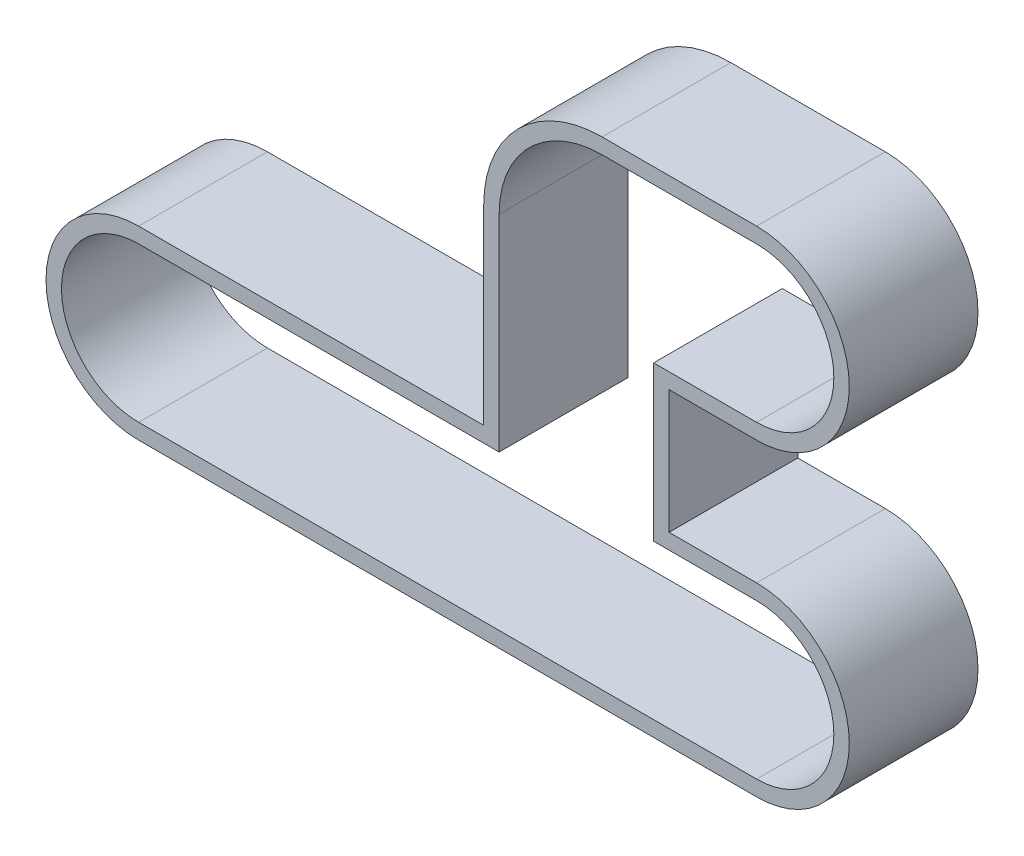
ISO-10303-21;
HEADER;
FILE_DESCRIPTION(('STEP AP214'),'2;1');
FILE_NAME('part.step','',(''),(''),'','','');
FILE_SCHEMA(('AUTOMOTIVE_DESIGN { 1 0 10303 214 1 1 1 1 }'));
ENDSEC;
DATA;
#1=APPLICATION_CONTEXT('core data for automotive mechanical design processes');
#2=APPLICATION_PROTOCOL_DEFINITION('international standard','automotive_design',2000,#1);
#3=PRODUCT_CONTEXT('',#1,'mechanical');
#4=PRODUCT('Part','Part','',(#3));
#5=PRODUCT_RELATED_PRODUCT_CATEGORY('part','',(#4));
#6=PRODUCT_DEFINITION_FORMATION('','',#4);
#7=PRODUCT_DEFINITION_CONTEXT('part definition',#1,'design');
#8=PRODUCT_DEFINITION('design','',#6,#7);
#9=PRODUCT_DEFINITION_SHAPE('','',#8);
#10=(LENGTH_UNIT() NAMED_UNIT(*) SI_UNIT(.MILLI.,.METRE.));
#11=(NAMED_UNIT(*) PLANE_ANGLE_UNIT() SI_UNIT($,.RADIAN.));
#12=(NAMED_UNIT(*) SI_UNIT($,.STERADIAN.) SOLID_ANGLE_UNIT());
#13=UNCERTAINTY_MEASURE_WITH_UNIT(LENGTH_MEASURE(1.E-05),#10,'distance_accuracy_value','');
#14=(GEOMETRIC_REPRESENTATION_CONTEXT(3) GLOBAL_UNCERTAINTY_ASSIGNED_CONTEXT((#13)) GLOBAL_UNIT_ASSIGNED_CONTEXT((#10,
#11,#12)) REPRESENTATION_CONTEXT('',''));
#15=CARTESIAN_POINT('',(0.,0.,0.));
#16=DIRECTION('',(0.,0.,1.));
#17=DIRECTION('',(1.,0.,0.));
#18=AXIS2_PLACEMENT_3D('',#15,#16,#17);
#19=CARTESIAN_POINT('',(0.,15.,25.));
#20=DIRECTION('',(0.,0.,1.));
#21=DIRECTION('',(1.,0.,0.));
#22=AXIS2_PLACEMENT_3D('',#19,#20,#21);
#23=PLANE('',#22);
#24=CARTESIAN_POINT('',(0.,15.,25.));
#25=DIRECTION('',(0.,0.,1.));
#26=DIRECTION('',(1.,0.,0.));
#27=AXIS2_PLACEMENT_3D('',#24,#25,#26);
#28=CIRCLE('',#27,18.);
#29=CARTESIAN_POINT('',(0.,33.,25.));
#30=VERTEX_POINT('',#29);
#31=CARTESIAN_POINT('',(0.,-3.,25.));
#32=VERTEX_POINT('',#31);
#33=EDGE_CURVE('E374',#30,#32,#28,.T.);
#34=ORIENTED_EDGE('',*,*,#33,.T.);
#35=DIRECTION('',(1.,0.,0.));
#36=VECTOR('',#35,1.);
#37=CARTESIAN_POINT('',(0.,-3.,25.));
#38=LINE('',#37,#36);
#39=CARTESIAN_POINT('',(120.,-3.,25.));
#40=VERTEX_POINT('',#39);
#41=EDGE_CURVE('E378',#32,#40,#38,.T.);
#42=ORIENTED_EDGE('',*,*,#41,.T.);
#43=CARTESIAN_POINT('',(120.,15.,25.));
#44=DIRECTION('',(0.,0.,1.));
#45=DIRECTION('',(1.,0.,0.));
#46=AXIS2_PLACEMENT_3D('',#43,#44,#45);
#47=CIRCLE('',#46,18.);
#48=CARTESIAN_POINT('',(120.,33.,25.));
#49=VERTEX_POINT('',#48);
#50=EDGE_CURVE('E382',#40,#49,#47,.T.);
#51=ORIENTED_EDGE('',*,*,#50,.T.);
#52=DIRECTION('',(-1.,0.,0.));
#53=VECTOR('',#52,1.);
#54=CARTESIAN_POINT('',(120.,33.,25.));
#55=LINE('',#54,#53);
#56=CARTESIAN_POINT('',(103.,33.,25.));
#57=VERTEX_POINT('',#56);
#58=EDGE_CURVE('E385',#49,#57,#55,.T.);
#59=ORIENTED_EDGE('',*,*,#58,.T.);
#60=DIRECTION('',(0.,1.,0.));
#61=VECTOR('',#60,1.);
#62=CARTESIAN_POINT('',(103.,30.,25.));
#63=LINE('',#62,#61);
#64=CARTESIAN_POINT('',(103.,57.,25.));
#65=VERTEX_POINT('',#64);
#66=EDGE_CURVE('E388',#57,#65,#63,.T.);
#67=ORIENTED_EDGE('',*,*,#66,.T.);
#68=DIRECTION('',(1.,0.,0.));
#69=VECTOR('',#68,1.);
#70=CARTESIAN_POINT('',(100.,57.,25.));
#71=LINE('',#70,#69);
#72=CARTESIAN_POINT('',(120.,57.,25.));
#73=VERTEX_POINT('',#72);
#74=EDGE_CURVE('E391',#65,#73,#71,.T.);
#75=ORIENTED_EDGE('',*,*,#74,.T.);
#76=CARTESIAN_POINT('',(120.,75.,25.));
#77=DIRECTION('',(0.,0.,1.));
#78=DIRECTION('',(1.,0.,0.));
#79=AXIS2_PLACEMENT_3D('',#76,#77,#78);
#80=CIRCLE('',#79,18.);
#81=CARTESIAN_POINT('',(120.,93.,25.));
#82=VERTEX_POINT('',#81);
#83=EDGE_CURVE('E394',#73,#82,#80,.T.);
#84=ORIENTED_EDGE('',*,*,#83,.T.);
#85=DIRECTION('',(-1.,0.,0.));
#86=VECTOR('',#85,1.);
#87=CARTESIAN_POINT('',(120.,93.,25.));
#88=LINE('',#87,#86);
#89=CARTESIAN_POINT('',(90.,93.,25.));
#90=VERTEX_POINT('',#89);
#91=EDGE_CURVE('E397',#82,#90,#88,.T.);
#92=ORIENTED_EDGE('',*,*,#91,.T.);
#93=CARTESIAN_POINT('',(90.,70.,25.));
#94=DIRECTION('',(0.,0.,1.));
#95=DIRECTION('',(1.,0.,0.));
#96=AXIS2_PLACEMENT_3D('',#93,#94,#95);
#97=CIRCLE('',#96,23.);
#98=CARTESIAN_POINT('',(67.,70.,25.));
#99=VERTEX_POINT('',#98);
#100=EDGE_CURVE('E400',#90,#99,#97,.T.);
#101=ORIENTED_EDGE('',*,*,#100,.T.);
#102=DIRECTION('',(0.,-1.,0.));
#103=VECTOR('',#102,1.);
#104=CARTESIAN_POINT('',(67.,70.,25.));
#105=LINE('',#104,#103);
#106=CARTESIAN_POINT('',(67.,33.,25.));
#107=VERTEX_POINT('',#106);
#108=EDGE_CURVE('E403',#99,#107,#105,.T.);
#109=ORIENTED_EDGE('',*,*,#108,.T.);
#110=DIRECTION('',(-1.,0.,0.));
#111=VECTOR('',#110,1.);
#112=CARTESIAN_POINT('',(70.,33.,25.));
#113=LINE('',#112,#111);
#114=EDGE_CURVE('E406',#107,#30,#113,.T.);
#115=ORIENTED_EDGE('',*,*,#114,.T.);
#116=EDGE_LOOP('',(#34,#42,#51,#59,#67,#75,#84,#92,#101,#109,#115));
#117=FACE_BOUND('',#116,.T.);
#118=DIRECTION('',(1.,0.,0.));
#119=VECTOR('',#118,1.);
#120=CARTESIAN_POINT('',(0.,0.,25.));
#121=LINE('',#120,#119);
#122=CARTESIAN_POINT('',(0.,0.,25.));
#123=VERTEX_POINT('',#122);
#124=CARTESIAN_POINT('',(120.,0.,25.));
#125=VERTEX_POINT('',#124);
#126=EDGE_CURVE('E264',#123,#125,#121,.T.);
#127=ORIENTED_EDGE('',*,*,#126,.F.);
#128=CARTESIAN_POINT('',(0.,15.,25.));
#129=DIRECTION('',(0.,0.,1.));
#130=DIRECTION('',(1.,0.,0.));
#131=AXIS2_PLACEMENT_3D('',#128,#129,#130);
#132=CIRCLE('',#131,15.);
#133=CARTESIAN_POINT('',(0.,30.,25.));
#134=VERTEX_POINT('',#133);
#135=EDGE_CURVE('E255',#134,#123,#132,.T.);
#136=ORIENTED_EDGE('',*,*,#135,.F.);
#137=DIRECTION('',(-1.,0.,0.));
#138=VECTOR('',#137,1.);
#139=CARTESIAN_POINT('',(70.,30.,25.));
#140=LINE('',#139,#138);
#141=CARTESIAN_POINT('',(70.,30.,25.));
#142=VERTEX_POINT('',#141);
#143=EDGE_CURVE('E305',#142,#134,#140,.T.);
#144=ORIENTED_EDGE('',*,*,#143,.F.);
#145=DIRECTION('',(0.,-1.,0.));
#146=VECTOR('',#145,1.);
#147=CARTESIAN_POINT('',(70.,70.,25.));
#148=LINE('',#147,#146);
#149=CARTESIAN_POINT('',(70.,70.,25.));
#150=VERTEX_POINT('',#149);
#151=EDGE_CURVE('E302',#150,#142,#148,.T.);
#152=ORIENTED_EDGE('',*,*,#151,.F.);
#153=CARTESIAN_POINT('',(90.,70.,25.));
#154=DIRECTION('',(0.,0.,1.));
#155=DIRECTION('',(1.,0.,0.));
#156=AXIS2_PLACEMENT_3D('',#153,#154,#155);
#157=CIRCLE('',#156,20.);
#158=CARTESIAN_POINT('',(90.,90.,25.));
#159=VERTEX_POINT('',#158);
#160=EDGE_CURVE('E299',#159,#150,#157,.T.);
#161=ORIENTED_EDGE('',*,*,#160,.F.);
#162=DIRECTION('',(-1.,0.,0.));
#163=VECTOR('',#162,1.);
#164=CARTESIAN_POINT('',(120.,90.,25.));
#165=LINE('',#164,#163);
#166=CARTESIAN_POINT('',(120.,90.,25.));
#167=VERTEX_POINT('',#166);
#168=EDGE_CURVE('E296',#167,#159,#165,.T.);
#169=ORIENTED_EDGE('',*,*,#168,.F.);
#170=CARTESIAN_POINT('',(120.,75.,25.));
#171=DIRECTION('',(0.,0.,1.));
#172=DIRECTION('',(1.,0.,0.));
#173=AXIS2_PLACEMENT_3D('',#170,#171,#172);
#174=CIRCLE('',#173,15.);
#175=CARTESIAN_POINT('',(120.,60.,25.));
#176=VERTEX_POINT('',#175);
#177=EDGE_CURVE('E293',#176,#167,#174,.T.);
#178=ORIENTED_EDGE('',*,*,#177,.F.);
#179=DIRECTION('',(1.,0.,0.));
#180=VECTOR('',#179,1.);
#181=CARTESIAN_POINT('',(100.,60.,25.));
#182=LINE('',#181,#180);
#183=CARTESIAN_POINT('',(100.,60.,25.));
#184=VERTEX_POINT('',#183);
#185=EDGE_CURVE('E290',#184,#176,#182,.T.);
#186=ORIENTED_EDGE('',*,*,#185,.F.);
#187=DIRECTION('',(0.,1.,0.));
#188=VECTOR('',#187,1.);
#189=CARTESIAN_POINT('',(100.,30.,25.));
#190=LINE('',#189,#188);
#191=CARTESIAN_POINT('',(100.,30.,25.));
#192=VERTEX_POINT('',#191);
#193=EDGE_CURVE('E287',#192,#184,#190,.T.);
#194=ORIENTED_EDGE('',*,*,#193,.F.);
#195=DIRECTION('',(-1.,0.,0.));
#196=VECTOR('',#195,1.);
#197=CARTESIAN_POINT('',(120.,30.,25.));
#198=LINE('',#197,#196);
#199=CARTESIAN_POINT('',(120.,30.,25.));
#200=VERTEX_POINT('',#199);
#201=EDGE_CURVE('E282',#200,#192,#198,.T.);
#202=ORIENTED_EDGE('',*,*,#201,.F.);
#203=CARTESIAN_POINT('',(120.,15.,25.));
#204=DIRECTION('',(0.,0.,1.));
#205=DIRECTION('',(1.,0.,0.));
#206=AXIS2_PLACEMENT_3D('',#203,#204,#205);
#207=CIRCLE('',#206,15.);
#208=EDGE_CURVE('E278',#125,#200,#207,.T.);
#209=ORIENTED_EDGE('',*,*,#208,.F.);
#210=EDGE_LOOP('',(#127,#136,#144,#152,#161,#169,#178,#186,#194,#202,#209));
#211=FACE_BOUND('',#210,.T.);
#212=ADVANCED_FACE('F105',(#117,#211),#23,.T.);
#213=CARTESIAN_POINT('',(0.,15.,0.));
#214=DIRECTION('',(0.,0.,1.));
#215=DIRECTION('',(1.,0.,0.));
#216=AXIS2_PLACEMENT_3D('',#213,#214,#215);
#217=PLANE('',#216);
#218=CARTESIAN_POINT('',(0.,15.,0.));
#219=DIRECTION('',(0.,0.,1.));
#220=DIRECTION('',(1.,0.,0.));
#221=AXIS2_PLACEMENT_3D('',#218,#219,#220);
#222=CIRCLE('',#221,18.);
#223=CARTESIAN_POINT('',(0.,33.,0.));
#224=VERTEX_POINT('',#223);
#225=CARTESIAN_POINT('',(0.,-3.,0.));
#226=VERTEX_POINT('',#225);
#227=EDGE_CURVE('E273',#224,#226,#222,.T.);
#228=ORIENTED_EDGE('',*,*,#227,.F.);
#229=DIRECTION('',(-1.,0.,0.));
#230=VECTOR('',#229,1.);
#231=CARTESIAN_POINT('',(70.,33.,0.));
#232=LINE('',#231,#230);
#233=CARTESIAN_POINT('',(67.,33.,0.));
#234=VERTEX_POINT('',#233);
#235=EDGE_CURVE('E379',#234,#224,#232,.T.);
#236=ORIENTED_EDGE('',*,*,#235,.F.);
#237=DIRECTION('',(0.,-1.,0.));
#238=VECTOR('',#237,1.);
#239=CARTESIAN_POINT('',(67.,70.,0.));
#240=LINE('',#239,#238);
#241=CARTESIAN_POINT('',(67.,70.,0.));
#242=VERTEX_POINT('',#241);
#243=EDGE_CURVE('E437',#242,#234,#240,.T.);
#244=ORIENTED_EDGE('',*,*,#243,.F.);
#245=CARTESIAN_POINT('',(90.,70.,0.));
#246=DIRECTION('',(0.,0.,1.));
#247=DIRECTION('',(1.,0.,0.));
#248=AXIS2_PLACEMENT_3D('',#245,#246,#247);
#249=CIRCLE('',#248,23.);
#250=CARTESIAN_POINT('',(90.,93.,0.));
#251=VERTEX_POINT('',#250);
#252=EDGE_CURVE('E434',#251,#242,#249,.T.);
#253=ORIENTED_EDGE('',*,*,#252,.F.);
#254=DIRECTION('',(-1.,0.,0.));
#255=VECTOR('',#254,1.);
#256=CARTESIAN_POINT('',(120.,93.,0.));
#257=LINE('',#256,#255);
#258=CARTESIAN_POINT('',(120.,93.,0.));
#259=VERTEX_POINT('',#258);
#260=EDGE_CURVE('E431',#259,#251,#257,.T.);
#261=ORIENTED_EDGE('',*,*,#260,.F.);
#262=CARTESIAN_POINT('',(120.,75.,0.));
#263=DIRECTION('',(0.,0.,1.));
#264=DIRECTION('',(1.,0.,0.));
#265=AXIS2_PLACEMENT_3D('',#262,#263,#264);
#266=CIRCLE('',#265,18.);
#267=CARTESIAN_POINT('',(120.,57.,0.));
#268=VERTEX_POINT('',#267);
#269=EDGE_CURVE('E428',#268,#259,#266,.T.);
#270=ORIENTED_EDGE('',*,*,#269,.F.);
#271=DIRECTION('',(1.,0.,0.));
#272=VECTOR('',#271,1.);
#273=CARTESIAN_POINT('',(100.,57.,0.));
#274=LINE('',#273,#272);
#275=CARTESIAN_POINT('',(103.,57.,0.));
#276=VERTEX_POINT('',#275);
#277=EDGE_CURVE('E425',#276,#268,#274,.T.);
#278=ORIENTED_EDGE('',*,*,#277,.F.);
#279=DIRECTION('',(0.,1.,0.));
#280=VECTOR('',#279,1.);
#281=CARTESIAN_POINT('',(103.,30.,0.));
#282=LINE('',#281,#280);
#283=CARTESIAN_POINT('',(103.,33.,0.));
#284=VERTEX_POINT('',#283);
#285=EDGE_CURVE('E422',#284,#276,#282,.T.);
#286=ORIENTED_EDGE('',*,*,#285,.F.);
#287=DIRECTION('',(-1.,0.,0.));
#288=VECTOR('',#287,1.);
#289=CARTESIAN_POINT('',(120.,33.,0.));
#290=LINE('',#289,#288);
#291=CARTESIAN_POINT('',(120.,33.,0.));
#292=VERTEX_POINT('',#291);
#293=EDGE_CURVE('E419',#292,#284,#290,.T.);
#294=ORIENTED_EDGE('',*,*,#293,.F.);
#295=CARTESIAN_POINT('',(120.,15.,0.));
#296=DIRECTION('',(0.,0.,1.));
#297=DIRECTION('',(1.,0.,0.));
#298=AXIS2_PLACEMENT_3D('',#295,#296,#297);
#299=CIRCLE('',#298,18.);
#300=CARTESIAN_POINT('',(120.,-3.,0.));
#301=VERTEX_POINT('',#300);
#302=EDGE_CURVE('E416',#301,#292,#299,.T.);
#303=ORIENTED_EDGE('',*,*,#302,.F.);
#304=DIRECTION('',(1.,0.,0.));
#305=VECTOR('',#304,1.);
#306=CARTESIAN_POINT('',(0.,-3.,0.));
#307=LINE('',#306,#305);
#308=EDGE_CURVE('E413',#226,#301,#307,.T.);
#309=ORIENTED_EDGE('',*,*,#308,.F.);
#310=EDGE_LOOP('',(#228,#236,#244,#253,#261,#270,#278,#286,#294,#303,#309));
#311=FACE_BOUND('',#310,.T.);
#312=CARTESIAN_POINT('',(0.,15.,0.));
#313=DIRECTION('',(0.,0.,1.));
#314=DIRECTION('',(1.,0.,0.));
#315=AXIS2_PLACEMENT_3D('',#312,#313,#314);
#316=CIRCLE('',#315,15.);
#317=CARTESIAN_POINT('',(0.,30.,0.));
#318=VERTEX_POINT('',#317);
#319=CARTESIAN_POINT('',(0.,0.,0.));
#320=VERTEX_POINT('',#319);
#321=EDGE_CURVE('E129',#318,#320,#316,.T.);
#322=ORIENTED_EDGE('',*,*,#321,.T.);
#323=DIRECTION('',(1.,0.,0.));
#324=VECTOR('',#323,1.);
#325=CARTESIAN_POINT('',(0.,0.,0.));
#326=LINE('',#325,#324);
#327=CARTESIAN_POINT('',(120.,0.,0.));
#328=VERTEX_POINT('',#327);
#329=EDGE_CURVE('E271',#320,#328,#326,.T.);
#330=ORIENTED_EDGE('',*,*,#329,.T.);
#331=CARTESIAN_POINT('',(120.,15.,0.));
#332=DIRECTION('',(0.,0.,1.));
#333=DIRECTION('',(1.,0.,0.));
#334=AXIS2_PLACEMENT_3D('',#331,#332,#333);
#335=CIRCLE('',#334,15.);
#336=CARTESIAN_POINT('',(120.,30.,0.));
#337=VERTEX_POINT('',#336);
#338=EDGE_CURVE('E312',#328,#337,#335,.T.);
#339=ORIENTED_EDGE('',*,*,#338,.T.);
#340=DIRECTION('',(-1.,0.,0.));
#341=VECTOR('',#340,1.);
#342=CARTESIAN_POINT('',(120.,30.,0.));
#343=LINE('',#342,#341);
#344=CARTESIAN_POINT('',(100.,30.,0.));
#345=VERTEX_POINT('',#344);
#346=EDGE_CURVE('E316',#337,#345,#343,.T.);
#347=ORIENTED_EDGE('',*,*,#346,.T.);
#348=DIRECTION('',(0.,1.,0.));
#349=VECTOR('',#348,1.);
#350=CARTESIAN_POINT('',(100.,30.,0.));
#351=LINE('',#350,#349);
#352=CARTESIAN_POINT('',(100.,60.,0.));
#353=VERTEX_POINT('',#352);
#354=EDGE_CURVE('E320',#345,#353,#351,.T.);
#355=ORIENTED_EDGE('',*,*,#354,.T.);
#356=DIRECTION('',(1.,0.,0.));
#357=VECTOR('',#356,1.);
#358=CARTESIAN_POINT('',(100.,60.,0.));
#359=LINE('',#358,#357);
#360=CARTESIAN_POINT('',(120.,60.,0.));
#361=VERTEX_POINT('',#360);
#362=EDGE_CURVE('E324',#353,#361,#359,.T.);
#363=ORIENTED_EDGE('',*,*,#362,.T.);
#364=CARTESIAN_POINT('',(120.,75.,0.));
#365=DIRECTION('',(0.,0.,1.));
#366=DIRECTION('',(1.,0.,0.));
#367=AXIS2_PLACEMENT_3D('',#364,#365,#366);
#368=CIRCLE('',#367,15.);
#369=CARTESIAN_POINT('',(120.,90.,0.));
#370=VERTEX_POINT('',#369);
#371=EDGE_CURVE('E328',#361,#370,#368,.T.);
#372=ORIENTED_EDGE('',*,*,#371,.T.);
#373=DIRECTION('',(-1.,0.,0.));
#374=VECTOR('',#373,1.);
#375=CARTESIAN_POINT('',(120.,90.,0.));
#376=LINE('',#375,#374);
#377=CARTESIAN_POINT('',(90.,90.,0.));
#378=VERTEX_POINT('',#377);
#379=EDGE_CURVE('E332',#370,#378,#376,.T.);
#380=ORIENTED_EDGE('',*,*,#379,.T.);
#381=CARTESIAN_POINT('',(90.,70.,0.));
#382=DIRECTION('',(0.,0.,1.));
#383=DIRECTION('',(1.,0.,0.));
#384=AXIS2_PLACEMENT_3D('',#381,#382,#383);
#385=CIRCLE('',#384,20.);
#386=CARTESIAN_POINT('',(70.,70.,0.));
#387=VERTEX_POINT('',#386);
#388=EDGE_CURVE('E336',#378,#387,#385,.T.);
#389=ORIENTED_EDGE('',*,*,#388,.T.);
#390=DIRECTION('',(0.,-1.,0.));
#391=VECTOR('',#390,1.);
#392=CARTESIAN_POINT('',(70.,70.,0.));
#393=LINE('',#392,#391);
#394=CARTESIAN_POINT('',(70.,30.,0.));
#395=VERTEX_POINT('',#394);
#396=EDGE_CURVE('E340',#387,#395,#393,.T.);
#397=ORIENTED_EDGE('',*,*,#396,.T.);
#398=DIRECTION('',(-1.,0.,0.));
#399=VECTOR('',#398,1.);
#400=CARTESIAN_POINT('',(70.,30.,0.));
#401=LINE('',#400,#399);
#402=EDGE_CURVE('E265',#395,#318,#401,.T.);
#403=ORIENTED_EDGE('',*,*,#402,.T.);
#404=EDGE_LOOP('',(#322,#330,#339,#347,#355,#363,#372,#380,#389,#397,#403));
#405=FACE_BOUND('',#404,.T.);
#406=ADVANCED_FACE('F488',(#311,#405),#217,.F.);
#407=CARTESIAN_POINT('',(0.,15.,25.));
#408=DIRECTION('',(0.,0.,-1.));
#409=DIRECTION('',(-1.,0.,0.));
#410=AXIS2_PLACEMENT_3D('',#407,#408,#409);
#411=CYLINDRICAL_SURFACE('',#410,18.);
#412=ORIENTED_EDGE('',*,*,#227,.T.);
#413=DIRECTION('',(0.,0.,-1.));
#414=VECTOR('',#413,1.);
#415=CARTESIAN_POINT('',(0.,-3.,25.));
#416=LINE('',#415,#414);
#417=EDGE_CURVE('E12',#32,#226,#416,.T.);
#418=ORIENTED_EDGE('',*,*,#417,.F.);
#419=ORIENTED_EDGE('',*,*,#33,.F.);
#420=DIRECTION('',(0.,0.,-1.));
#421=VECTOR('',#420,1.);
#422=CARTESIAN_POINT('',(0.,33.,25.));
#423=LINE('',#422,#421);
#424=EDGE_CURVE('E409',#30,#224,#423,.T.);
#425=ORIENTED_EDGE('',*,*,#424,.T.);
#426=EDGE_LOOP('',(#412,#418,#419,#425));
#427=FACE_BOUND('',#426,.T.);
#428=ADVANCED_FACE('F107',(#427),#411,.T.);
#429=CARTESIAN_POINT('',(0.,-3.,25.));
#430=DIRECTION('',(0.,1.,0.));
#431=DIRECTION('',(0.,0.,1.));
#432=AXIS2_PLACEMENT_3D('',#429,#430,#431);
#433=PLANE('',#432);
#434=ORIENTED_EDGE('',*,*,#308,.T.);
#435=DIRECTION('',(0.,0.,-1.));
#436=VECTOR('',#435,1.);
#437=CARTESIAN_POINT('',(120.,-3.,25.));
#438=LINE('',#437,#436);
#439=EDGE_CURVE('E114',#40,#301,#438,.T.);
#440=ORIENTED_EDGE('',*,*,#439,.F.);
#441=ORIENTED_EDGE('',*,*,#41,.F.);
#442=ORIENTED_EDGE('',*,*,#417,.T.);
#443=EDGE_LOOP('',(#434,#440,#441,#442));
#444=FACE_BOUND('',#443,.T.);
#445=ADVANCED_FACE('F505',(#444),#433,.F.);
#446=CARTESIAN_POINT('',(120.,15.,25.));
#447=DIRECTION('',(0.,0.,-1.));
#448=DIRECTION('',(-1.,0.,0.));
#449=AXIS2_PLACEMENT_3D('',#446,#447,#448);
#450=CYLINDRICAL_SURFACE('',#449,18.);
#451=ORIENTED_EDGE('',*,*,#302,.T.);
#452=DIRECTION('',(0.,0.,-1.));
#453=VECTOR('',#452,1.);
#454=CARTESIAN_POINT('',(120.,33.,25.));
#455=LINE('',#454,#453);
#456=EDGE_CURVE('E473',#49,#292,#455,.T.);
#457=ORIENTED_EDGE('',*,*,#456,.F.);
#458=ORIENTED_EDGE('',*,*,#50,.F.);
#459=ORIENTED_EDGE('',*,*,#439,.T.);
#460=EDGE_LOOP('',(#451,#457,#458,#459));
#461=FACE_BOUND('',#460,.T.);
#462=ADVANCED_FACE('F482',(#461),#450,.T.);
#463=CARTESIAN_POINT('',(120.,33.,25.));
#464=DIRECTION('',(0.,-1.,0.));
#465=DIRECTION('',(0.,0.,-1.));
#466=AXIS2_PLACEMENT_3D('',#463,#464,#465);
#467=PLANE('',#466);
#468=ORIENTED_EDGE('',*,*,#293,.T.);
#469=DIRECTION('',(0.,0.,-1.));
#470=VECTOR('',#469,1.);
#471=CARTESIAN_POINT('',(103.,33.,25.));
#472=LINE('',#471,#470);
#473=EDGE_CURVE('E469',#57,#284,#472,.T.);
#474=ORIENTED_EDGE('',*,*,#473,.F.);
#475=ORIENTED_EDGE('',*,*,#58,.F.);
#476=ORIENTED_EDGE('',*,*,#456,.T.);
#477=EDGE_LOOP('',(#468,#474,#475,#476));
#478=FACE_BOUND('',#477,.T.);
#479=ADVANCED_FACE('F494',(#478),#467,.F.);
#480=CARTESIAN_POINT('',(103.,30.,25.));
#481=DIRECTION('',(-1.,0.,0.));
#482=DIRECTION('',(0.,0.,1.));
#483=AXIS2_PLACEMENT_3D('',#480,#481,#482);
#484=PLANE('',#483);
#485=ORIENTED_EDGE('',*,*,#285,.T.);
#486=DIRECTION('',(0.,0.,-1.));
#487=VECTOR('',#486,1.);
#488=CARTESIAN_POINT('',(103.,57.,25.));
#489=LINE('',#488,#487);
#490=EDGE_CURVE('E465',#65,#276,#489,.T.);
#491=ORIENTED_EDGE('',*,*,#490,.F.);
#492=ORIENTED_EDGE('',*,*,#66,.F.);
#493=ORIENTED_EDGE('',*,*,#473,.T.);
#494=EDGE_LOOP('',(#485,#491,#492,#493));
#495=FACE_BOUND('',#494,.T.);
#496=ADVANCED_FACE('F498',(#495),#484,.F.);
#497=CARTESIAN_POINT('',(100.,57.,25.));
#498=DIRECTION('',(0.,1.,0.));
#499=DIRECTION('',(-1.,0.,0.));
#500=AXIS2_PLACEMENT_3D('',#497,#498,#499);
#501=PLANE('',#500);
#502=ORIENTED_EDGE('',*,*,#277,.T.);
#503=DIRECTION('',(0.,0.,-1.));
#504=VECTOR('',#503,1.);
#505=CARTESIAN_POINT('',(120.,57.,25.));
#506=LINE('',#505,#504);
#507=EDGE_CURVE('E461',#73,#268,#506,.T.);
#508=ORIENTED_EDGE('',*,*,#507,.F.);
#509=ORIENTED_EDGE('',*,*,#74,.F.);
#510=ORIENTED_EDGE('',*,*,#490,.T.);
#511=EDGE_LOOP('',(#502,#508,#509,#510));
#512=FACE_BOUND('',#511,.T.);
#513=ADVANCED_FACE('F533',(#512),#501,.F.);
#514=CARTESIAN_POINT('',(120.,75.,25.));
#515=DIRECTION('',(0.,0.,-1.));
#516=DIRECTION('',(-1.,0.,0.));
#517=AXIS2_PLACEMENT_3D('',#514,#515,#516);
#518=CYLINDRICAL_SURFACE('',#517,18.);
#519=ORIENTED_EDGE('',*,*,#269,.T.);
#520=DIRECTION('',(0.,0.,-1.));
#521=VECTOR('',#520,1.);
#522=CARTESIAN_POINT('',(120.,93.,25.));
#523=LINE('',#522,#521);
#524=EDGE_CURVE('E457',#82,#259,#523,.T.);
#525=ORIENTED_EDGE('',*,*,#524,.F.);
#526=ORIENTED_EDGE('',*,*,#83,.F.);
#527=ORIENTED_EDGE('',*,*,#507,.T.);
#528=EDGE_LOOP('',(#519,#525,#526,#527));
#529=FACE_BOUND('',#528,.T.);
#530=ADVANCED_FACE('F531',(#529),#518,.T.);
#531=CARTESIAN_POINT('',(120.,93.,25.));
#532=DIRECTION('',(0.,-1.,0.));
#533=DIRECTION('',(0.,0.,-1.));
#534=AXIS2_PLACEMENT_3D('',#531,#532,#533);
#535=PLANE('',#534);
#536=ORIENTED_EDGE('',*,*,#260,.T.);
#537=DIRECTION('',(0.,0.,-1.));
#538=VECTOR('',#537,1.);
#539=CARTESIAN_POINT('',(90.,93.,25.));
#540=LINE('',#539,#538);
#541=EDGE_CURVE('E453',#90,#251,#540,.T.);
#542=ORIENTED_EDGE('',*,*,#541,.F.);
#543=ORIENTED_EDGE('',*,*,#91,.F.);
#544=ORIENTED_EDGE('',*,*,#524,.T.);
#545=EDGE_LOOP('',(#536,#542,#543,#544));
#546=FACE_BOUND('',#545,.T.);
#547=ADVANCED_FACE('F526',(#546),#535,.F.);
#548=CARTESIAN_POINT('',(90.,70.,25.));
#549=DIRECTION('',(0.,0.,-1.));
#550=DIRECTION('',(-1.,0.,0.));
#551=AXIS2_PLACEMENT_3D('',#548,#549,#550);
#552=CYLINDRICAL_SURFACE('',#551,23.);
#553=ORIENTED_EDGE('',*,*,#252,.T.);
#554=DIRECTION('',(0.,0.,-1.));
#555=VECTOR('',#554,1.);
#556=CARTESIAN_POINT('',(67.,70.,25.));
#557=LINE('',#556,#555);
#558=EDGE_CURVE('E449',#99,#242,#557,.T.);
#559=ORIENTED_EDGE('',*,*,#558,.F.);
#560=ORIENTED_EDGE('',*,*,#100,.F.);
#561=ORIENTED_EDGE('',*,*,#541,.T.);
#562=EDGE_LOOP('',(#553,#559,#560,#561));
#563=FACE_BOUND('',#562,.T.);
#564=ADVANCED_FACE('F521',(#563),#552,.T.);
#565=CARTESIAN_POINT('',(67.,70.,25.));
#566=DIRECTION('',(1.,0.,0.));
#567=DIRECTION('',(0.,0.,-1.));
#568=AXIS2_PLACEMENT_3D('',#565,#566,#567);
#569=PLANE('',#568);
#570=ORIENTED_EDGE('',*,*,#243,.T.);
#571=DIRECTION('',(0.,0.,-1.));
#572=VECTOR('',#571,1.);
#573=CARTESIAN_POINT('',(67.,33.,25.));
#574=LINE('',#573,#572);
#575=EDGE_CURVE('E445',#107,#234,#574,.T.);
#576=ORIENTED_EDGE('',*,*,#575,.F.);
#577=ORIENTED_EDGE('',*,*,#108,.F.);
#578=ORIENTED_EDGE('',*,*,#558,.T.);
#579=EDGE_LOOP('',(#570,#576,#577,#578));
#580=FACE_BOUND('',#579,.T.);
#581=ADVANCED_FACE('F517',(#580),#569,.F.);
#582=CARTESIAN_POINT('',(70.,33.,25.));
#583=DIRECTION('',(0.,-1.,0.));
#584=DIRECTION('',(1.,0.,0.));
#585=AXIS2_PLACEMENT_3D('',#582,#583,#584);
#586=PLANE('',#585);
#587=ORIENTED_EDGE('',*,*,#235,.T.);
#588=ORIENTED_EDGE('',*,*,#424,.F.);
#589=ORIENTED_EDGE('',*,*,#114,.F.);
#590=ORIENTED_EDGE('',*,*,#575,.T.);
#591=EDGE_LOOP('',(#587,#588,#589,#590));
#592=FACE_BOUND('',#591,.T.);
#593=ADVANCED_FACE('F512',(#592),#586,.F.);
#594=CARTESIAN_POINT('',(0.,15.,25.));
#595=DIRECTION('',(0.,0.,-1.));
#596=DIRECTION('',(-1.,0.,0.));
#597=AXIS2_PLACEMENT_3D('',#594,#595,#596);
#598=CYLINDRICAL_SURFACE('',#597,15.);
#599=ORIENTED_EDGE('',*,*,#321,.F.);
#600=DIRECTION('',(0.,0.,-1.));
#601=VECTOR('',#600,1.);
#602=CARTESIAN_POINT('',(0.,30.,25.));
#603=LINE('',#602,#601);
#604=EDGE_CURVE('E259',#134,#318,#603,.T.);
#605=ORIENTED_EDGE('',*,*,#604,.F.);
#606=ORIENTED_EDGE('',*,*,#135,.T.);
#607=DIRECTION('',(0.,0.,-1.));
#608=VECTOR('',#607,1.);
#609=CARTESIAN_POINT('',(0.,0.,25.));
#610=LINE('',#609,#608);
#611=EDGE_CURVE('E258',#123,#320,#610,.T.);
#612=ORIENTED_EDGE('',*,*,#611,.T.);
#613=EDGE_LOOP('',(#599,#605,#606,#612));
#614=FACE_BOUND('',#613,.T.);
#615=ADVANCED_FACE('F257',(#614),#598,.F.);
#616=CARTESIAN_POINT('',(0.,0.,25.));
#617=DIRECTION('',(0.,1.,0.));
#618=DIRECTION('',(0.,0.,1.));
#619=AXIS2_PLACEMENT_3D('',#616,#617,#618);
#620=PLANE('',#619);
#621=ORIENTED_EDGE('',*,*,#329,.F.);
#622=ORIENTED_EDGE('',*,*,#611,.F.);
#623=ORIENTED_EDGE('',*,*,#126,.T.);
#624=DIRECTION('',(0.,0.,-1.));
#625=VECTOR('',#624,1.);
#626=CARTESIAN_POINT('',(120.,0.,25.));
#627=LINE('',#626,#625);
#628=EDGE_CURVE('E274',#125,#328,#627,.T.);
#629=ORIENTED_EDGE('',*,*,#628,.T.);
#630=EDGE_LOOP('',(#621,#622,#623,#629));
#631=FACE_BOUND('',#630,.T.);
#632=ADVANCED_FACE('F268',(#631),#620,.T.);
#633=CARTESIAN_POINT('',(120.,15.,25.));
#634=DIRECTION('',(0.,0.,-1.));
#635=DIRECTION('',(-1.,0.,0.));
#636=AXIS2_PLACEMENT_3D('',#633,#634,#635);
#637=CYLINDRICAL_SURFACE('',#636,15.);
#638=ORIENTED_EDGE('',*,*,#338,.F.);
#639=ORIENTED_EDGE('',*,*,#628,.F.);
#640=ORIENTED_EDGE('',*,*,#208,.T.);
#641=DIRECTION('',(0.,0.,-1.));
#642=VECTOR('',#641,1.);
#643=CARTESIAN_POINT('',(120.,30.,25.));
#644=LINE('',#643,#642);
#645=EDGE_CURVE('E369',#200,#337,#644,.T.);
#646=ORIENTED_EDGE('',*,*,#645,.T.);
#647=EDGE_LOOP('',(#638,#639,#640,#646));
#648=FACE_BOUND('',#647,.T.);
#649=ADVANCED_FACE('F585',(#648),#637,.F.);
#650=CARTESIAN_POINT('',(120.,30.,25.));
#651=DIRECTION('',(0.,-1.,0.));
#652=DIRECTION('',(0.,0.,-1.));
#653=AXIS2_PLACEMENT_3D('',#650,#651,#652);
#654=PLANE('',#653);
#655=ORIENTED_EDGE('',*,*,#346,.F.);
#656=ORIENTED_EDGE('',*,*,#645,.F.);
#657=ORIENTED_EDGE('',*,*,#201,.T.);
#658=DIRECTION('',(0.,0.,-1.));
#659=VECTOR('',#658,1.);
#660=CARTESIAN_POINT('',(100.,30.,25.));
#661=LINE('',#660,#659);
#662=EDGE_CURVE('E366',#192,#345,#661,.T.);
#663=ORIENTED_EDGE('',*,*,#662,.T.);
#664=EDGE_LOOP('',(#655,#656,#657,#663));
#665=FACE_BOUND('',#664,.T.);
#666=ADVANCED_FACE('F591',(#665),#654,.T.);
#667=CARTESIAN_POINT('',(100.,30.,25.));
#668=DIRECTION('',(-1.,0.,0.));
#669=DIRECTION('',(0.,0.,1.));
#670=AXIS2_PLACEMENT_3D('',#667,#668,#669);
#671=PLANE('',#670);
#672=ORIENTED_EDGE('',*,*,#354,.F.);
#673=ORIENTED_EDGE('',*,*,#662,.F.);
#674=ORIENTED_EDGE('',*,*,#193,.T.);
#675=DIRECTION('',(0.,0.,-1.));
#676=VECTOR('',#675,1.);
#677=CARTESIAN_POINT('',(100.,60.,25.));
#678=LINE('',#677,#676);
#679=EDGE_CURVE('E363',#184,#353,#678,.T.);
#680=ORIENTED_EDGE('',*,*,#679,.T.);
#681=EDGE_LOOP('',(#672,#673,#674,#680));
#682=FACE_BOUND('',#681,.T.);
#683=ADVANCED_FACE('F599',(#682),#671,.T.);
#684=CARTESIAN_POINT('',(100.,60.,25.));
#685=DIRECTION('',(0.,1.,0.));
#686=DIRECTION('',(-1.,0.,0.));
#687=AXIS2_PLACEMENT_3D('',#684,#685,#686);
#688=PLANE('',#687);
#689=ORIENTED_EDGE('',*,*,#362,.F.);
#690=ORIENTED_EDGE('',*,*,#679,.F.);
#691=ORIENTED_EDGE('',*,*,#185,.T.);
#692=DIRECTION('',(0.,0.,-1.));
#693=VECTOR('',#692,1.);
#694=CARTESIAN_POINT('',(120.,60.,25.));
#695=LINE('',#694,#693);
#696=EDGE_CURVE('E360',#176,#361,#695,.T.);
#697=ORIENTED_EDGE('',*,*,#696,.T.);
#698=EDGE_LOOP('',(#689,#690,#691,#697));
#699=FACE_BOUND('',#698,.T.);
#700=ADVANCED_FACE('F607',(#699),#688,.T.);
#701=CARTESIAN_POINT('',(120.,75.,25.));
#702=DIRECTION('',(0.,0.,-1.));
#703=DIRECTION('',(-1.,0.,0.));
#704=AXIS2_PLACEMENT_3D('',#701,#702,#703);
#705=CYLINDRICAL_SURFACE('',#704,15.);
#706=ORIENTED_EDGE('',*,*,#371,.F.);
#707=ORIENTED_EDGE('',*,*,#696,.F.);
#708=ORIENTED_EDGE('',*,*,#177,.T.);
#709=DIRECTION('',(0.,0.,-1.));
#710=VECTOR('',#709,1.);
#711=CARTESIAN_POINT('',(120.,90.,25.));
#712=LINE('',#711,#710);
#713=EDGE_CURVE('E357',#167,#370,#712,.T.);
#714=ORIENTED_EDGE('',*,*,#713,.T.);
#715=EDGE_LOOP('',(#706,#707,#708,#714));
#716=FACE_BOUND('',#715,.T.);
#717=ADVANCED_FACE('F615',(#716),#705,.F.);
#718=CARTESIAN_POINT('',(120.,90.,25.));
#719=DIRECTION('',(0.,-1.,0.));
#720=DIRECTION('',(0.,0.,-1.));
#721=AXIS2_PLACEMENT_3D('',#718,#719,#720);
#722=PLANE('',#721);
#723=ORIENTED_EDGE('',*,*,#379,.F.);
#724=ORIENTED_EDGE('',*,*,#713,.F.);
#725=ORIENTED_EDGE('',*,*,#168,.T.);
#726=DIRECTION('',(0.,0.,-1.));
#727=VECTOR('',#726,1.);
#728=CARTESIAN_POINT('',(90.,90.,25.));
#729=LINE('',#728,#727);
#730=EDGE_CURVE('E354',#159,#378,#729,.T.);
#731=ORIENTED_EDGE('',*,*,#730,.T.);
#732=EDGE_LOOP('',(#723,#724,#725,#731));
#733=FACE_BOUND('',#732,.T.);
#734=ADVANCED_FACE('F623',(#733),#722,.T.);
#735=CARTESIAN_POINT('',(90.,70.,25.));
#736=DIRECTION('',(0.,0.,-1.));
#737=DIRECTION('',(-1.,0.,0.));
#738=AXIS2_PLACEMENT_3D('',#735,#736,#737);
#739=CYLINDRICAL_SURFACE('',#738,20.);
#740=ORIENTED_EDGE('',*,*,#388,.F.);
#741=ORIENTED_EDGE('',*,*,#730,.F.);
#742=ORIENTED_EDGE('',*,*,#160,.T.);
#743=DIRECTION('',(0.,0.,-1.));
#744=VECTOR('',#743,1.);
#745=CARTESIAN_POINT('',(70.,70.,25.));
#746=LINE('',#745,#744);
#747=EDGE_CURVE('E351',#150,#387,#746,.T.);
#748=ORIENTED_EDGE('',*,*,#747,.T.);
#749=EDGE_LOOP('',(#740,#741,#742,#748));
#750=FACE_BOUND('',#749,.T.);
#751=ADVANCED_FACE('F631',(#750),#739,.F.);
#752=CARTESIAN_POINT('',(70.,70.,25.));
#753=DIRECTION('',(1.,0.,0.));
#754=DIRECTION('',(0.,0.,-1.));
#755=AXIS2_PLACEMENT_3D('',#752,#753,#754);
#756=PLANE('',#755);
#757=ORIENTED_EDGE('',*,*,#396,.F.);
#758=ORIENTED_EDGE('',*,*,#747,.F.);
#759=ORIENTED_EDGE('',*,*,#151,.T.);
#760=DIRECTION('',(0.,0.,-1.));
#761=VECTOR('',#760,1.);
#762=CARTESIAN_POINT('',(70.,30.,25.));
#763=LINE('',#762,#761);
#764=EDGE_CURVE('E121',#142,#395,#763,.T.);
#765=ORIENTED_EDGE('',*,*,#764,.T.);
#766=EDGE_LOOP('',(#757,#758,#759,#765));
#767=FACE_BOUND('',#766,.T.);
#768=ADVANCED_FACE('F639',(#767),#756,.T.);
#769=CARTESIAN_POINT('',(70.,30.,25.));
#770=DIRECTION('',(0.,-1.,0.));
#771=DIRECTION('',(1.,0.,0.));
#772=AXIS2_PLACEMENT_3D('',#769,#770,#771);
#773=PLANE('',#772);
#774=ORIENTED_EDGE('',*,*,#402,.F.);
#775=ORIENTED_EDGE('',*,*,#764,.F.);
#776=ORIENTED_EDGE('',*,*,#143,.T.);
#777=ORIENTED_EDGE('',*,*,#604,.T.);
#778=EDGE_LOOP('',(#774,#775,#776,#777));
#779=FACE_BOUND('',#778,.T.);
#780=ADVANCED_FACE('F647',(#779),#773,.T.);
#781=CLOSED_SHELL('',(#212,#406,#428,#445,#462,#479,#496,#513,#530,#547,#564,#581,#593,#615,
#632,#649,#666,#683,#700,#717,#734,#751,#768,#780));
#782=MANIFOLD_SOLID_BREP('B2',#781);
#783=ADVANCED_BREP_SHAPE_REPRESENTATION('',(#18,#782),#14);
#784=SHAPE_DEFINITION_REPRESENTATION(#9,#783);
ENDSEC;
END-ISO-10303-21;
